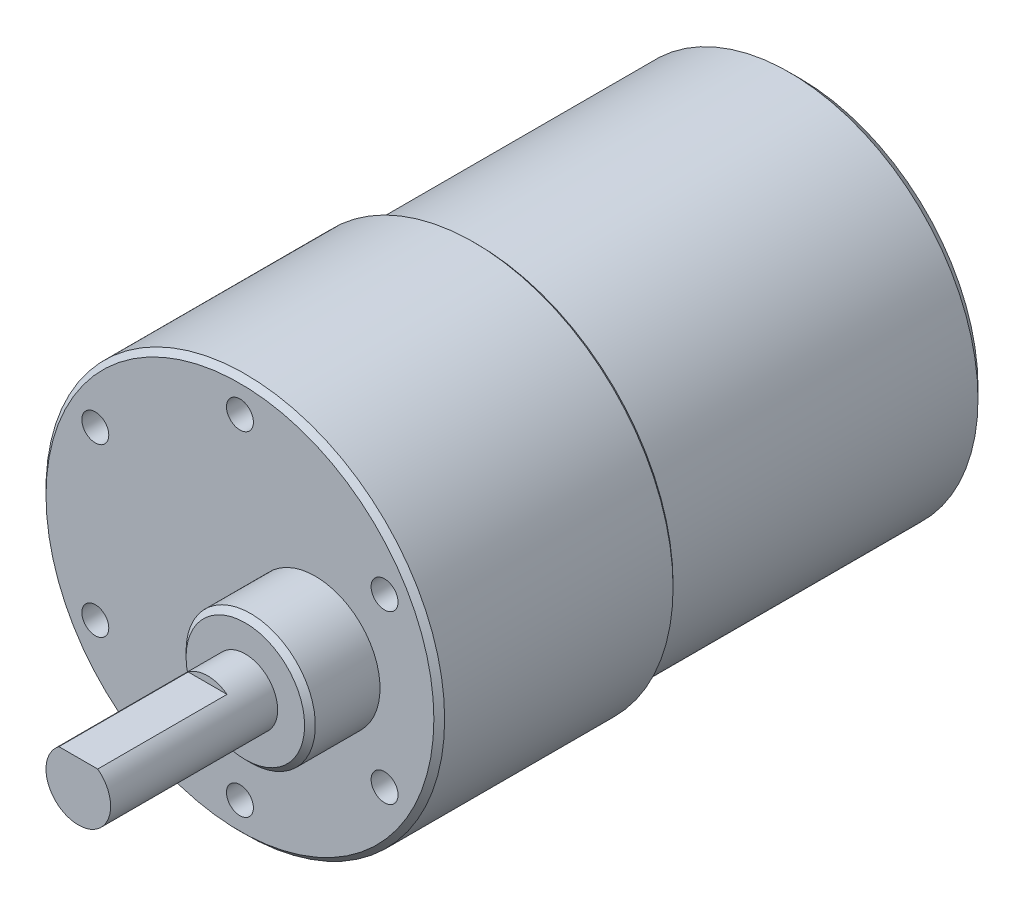
ISO-10303-21;
HEADER;
FILE_DESCRIPTION(('STEP AP214'),'2;1');
FILE_NAME('part.step','',(''),(''),'','','');
FILE_SCHEMA(('AUTOMOTIVE_DESIGN { 1 0 10303 214 1 1 1 1 }'));
ENDSEC;
DATA;
#1=APPLICATION_CONTEXT('core data for automotive mechanical design processes');
#2=APPLICATION_PROTOCOL_DEFINITION('international standard','automotive_design',2000,#1);
#3=PRODUCT_CONTEXT('',#1,'mechanical');
#4=PRODUCT('Part','Part','',(#3));
#5=PRODUCT_RELATED_PRODUCT_CATEGORY('part','',(#4));
#6=PRODUCT_DEFINITION_FORMATION('','',#4);
#7=PRODUCT_DEFINITION_CONTEXT('part definition',#1,'design');
#8=PRODUCT_DEFINITION('design','',#6,#7);
#9=PRODUCT_DEFINITION_SHAPE('','',#8);
#10=(LENGTH_UNIT() NAMED_UNIT(*) SI_UNIT(.MILLI.,.METRE.));
#11=(NAMED_UNIT(*) PLANE_ANGLE_UNIT() SI_UNIT($,.RADIAN.));
#12=(NAMED_UNIT(*) SI_UNIT($,.STERADIAN.) SOLID_ANGLE_UNIT());
#13=UNCERTAINTY_MEASURE_WITH_UNIT(LENGTH_MEASURE(1.E-05),#10,'distance_accuracy_value','');
#14=(GEOMETRIC_REPRESENTATION_CONTEXT(3) GLOBAL_UNCERTAINTY_ASSIGNED_CONTEXT((#13)) GLOBAL_UNIT_ASSIGNED_CONTEXT((#10,
#11,#12)) REPRESENTATION_CONTEXT('',''));
#15=CARTESIAN_POINT('',(0.,0.,0.));
#16=DIRECTION('',(0.,0.,1.));
#17=DIRECTION('',(1.,0.,0.));
#18=AXIS2_PLACEMENT_3D('',#15,#16,#17);
#19=CARTESIAN_POINT('',(0.,0.,62.));
#20=DIRECTION('',(0.,0.,1.));
#21=DIRECTION('',(1.,0.,0.));
#22=AXIS2_PLACEMENT_3D('',#19,#20,#21);
#23=PLANE('',#22);
#24=CARTESIAN_POINT('',(7.,0.,62.));
#25=DIRECTION('',(0.,0.,1.));
#26=DIRECTION('',(1.,0.,0.));
#27=AXIS2_PLACEMENT_3D('',#24,#25,#26);
#28=CIRCLE('',#27,3.);
#29=CARTESIAN_POINT('',(8.8,2.4,62.));
#30=VERTEX_POINT('',#29);
#31=CARTESIAN_POINT('',(5.2,2.4,62.));
#32=VERTEX_POINT('',#31);
#33=EDGE_CURVE('E244',#30,#32,#28,.T.);
#34=ORIENTED_EDGE('',*,*,#33,.T.);
#35=DIRECTION('',(1.,0.,0.));
#36=VECTOR('',#35,1.);
#37=CARTESIAN_POINT('',(0.,2.4,62.));
#38=LINE('',#37,#36);
#39=EDGE_CURVE('E87',#32,#30,#38,.T.);
#40=ORIENTED_EDGE('',*,*,#39,.T.);
#41=EDGE_LOOP('',(#34,#40));
#42=FACE_BOUND('',#41,.T.);
#43=ADVANCED_FACE('F39',(#42),#23,.T.);
#44=CARTESIAN_POINT('',(7.,0.,58.5));
#45=DIRECTION('',(0.,0.,1.));
#46=DIRECTION('',(1.,0.,0.));
#47=AXIS2_PLACEMENT_3D('',#44,#45,#46);
#48=PLANE('',#47);
#49=CARTESIAN_POINT('',(7.,0.,58.5));
#50=DIRECTION('',(0.,0.,1.));
#51=DIRECTION('',(1.,0.,0.));
#52=AXIS2_PLACEMENT_3D('',#49,#50,#51);
#53=CIRCLE('',#52,5.50000000000007);
#54=CARTESIAN_POINT('',(12.5000000000001,0.,58.5));
#55=VERTEX_POINT('',#54);
#56=EDGE_CURVE('E121',#55,#55,#53,.T.);
#57=ORIENTED_EDGE('',*,*,#56,.T.);
#58=EDGE_LOOP('',(#57));
#59=FACE_BOUND('',#58,.T.);
#60=CARTESIAN_POINT('',(7.,0.,58.5));
#61=DIRECTION('',(0.,0.,1.));
#62=DIRECTION('',(1.,0.,0.));
#63=AXIS2_PLACEMENT_3D('',#60,#61,#62);
#64=CIRCLE('',#63,3.);
#65=CARTESIAN_POINT('',(10.,0.,58.5));
#66=VERTEX_POINT('',#65);
#67=EDGE_CURVE('E91',#66,#66,#64,.T.);
#68=ORIENTED_EDGE('',*,*,#67,.F.);
#69=EDGE_LOOP('',(#68));
#70=FACE_BOUND('',#69,.T.);
#71=ADVANCED_FACE('F148',(#59,#70),#48,.T.);
#72=CARTESIAN_POINT('',(0.,0.,52.));
#73=DIRECTION('',(0.,0.,1.));
#74=DIRECTION('',(1.,0.,0.));
#75=AXIS2_PLACEMENT_3D('',#72,#73,#74);
#76=PLANE('',#75);
#77=CARTESIAN_POINT('',(0.,0.,52.));
#78=DIRECTION('',(0.,0.,1.));
#79=DIRECTION('',(1.,0.,0.));
#80=AXIS2_PLACEMENT_3D('',#77,#78,#79);
#81=CIRCLE('',#80,18.);
#82=CARTESIAN_POINT('',(18.,0.,52.));
#83=VERTEX_POINT('',#82);
#84=EDGE_CURVE('E114',#83,#83,#81,.T.);
#85=ORIENTED_EDGE('',*,*,#84,.T.);
#86=EDGE_LOOP('',(#85));
#87=FACE_BOUND('',#86,.T.);
#88=CARTESIAN_POINT('',(0.,-15.5,52.));
#89=DIRECTION('',(0.,0.,1.));
#90=DIRECTION('',(1.,0.,0.));
#91=AXIS2_PLACEMENT_3D('',#88,#89,#90);
#92=CIRCLE('',#91,1.25);
#93=CARTESIAN_POINT('',(1.25,-15.5,52.));
#94=VERTEX_POINT('',#93);
#95=EDGE_CURVE('E254',#94,#94,#92,.T.);
#96=ORIENTED_EDGE('',*,*,#95,.F.);
#97=EDGE_LOOP('',(#96));
#98=FACE_BOUND('',#97,.T.);
#99=CARTESIAN_POINT('',(-13.4233937586588,-7.75,52.));
#100=DIRECTION('',(0.,0.,1.));
#101=DIRECTION('',(1.,0.,0.));
#102=AXIS2_PLACEMENT_3D('',#99,#100,#101);
#103=CIRCLE('',#102,1.25);
#104=CARTESIAN_POINT('',(-12.1733937586588,-7.75,52.));
#105=VERTEX_POINT('',#104);
#106=EDGE_CURVE('E260',#105,#105,#103,.T.);
#107=ORIENTED_EDGE('',*,*,#106,.F.);
#108=EDGE_LOOP('',(#107));
#109=FACE_BOUND('',#108,.T.);
#110=CARTESIAN_POINT('',(-13.4233937586588,7.75000000000001,52.));
#111=DIRECTION('',(0.,0.,1.));
#112=DIRECTION('',(1.,0.,0.));
#113=AXIS2_PLACEMENT_3D('',#110,#111,#112);
#114=CIRCLE('',#113,1.25);
#115=CARTESIAN_POINT('',(-12.1733937586588,7.75000000000001,52.));
#116=VERTEX_POINT('',#115);
#117=EDGE_CURVE('E266',#116,#116,#114,.T.);
#118=ORIENTED_EDGE('',*,*,#117,.F.);
#119=EDGE_LOOP('',(#118));
#120=FACE_BOUND('',#119,.T.);
#121=CARTESIAN_POINT('',(0.,15.5,52.));
#122=DIRECTION('',(0.,0.,1.));
#123=DIRECTION('',(1.,0.,0.));
#124=AXIS2_PLACEMENT_3D('',#121,#122,#123);
#125=CIRCLE('',#124,1.25);
#126=CARTESIAN_POINT('',(1.25,15.5,52.));
#127=VERTEX_POINT('',#126);
#128=EDGE_CURVE('E272',#127,#127,#125,.T.);
#129=ORIENTED_EDGE('',*,*,#128,.F.);
#130=EDGE_LOOP('',(#129));
#131=FACE_BOUND('',#130,.T.);
#132=CARTESIAN_POINT('',(13.4233937586588,7.75000000000001,52.));
#133=DIRECTION('',(0.,0.,1.));
#134=DIRECTION('',(1.,0.,0.));
#135=AXIS2_PLACEMENT_3D('',#132,#133,#134);
#136=CIRCLE('',#135,1.25);
#137=CARTESIAN_POINT('',(14.6733937586588,7.75000000000001,52.));
#138=VERTEX_POINT('',#137);
#139=EDGE_CURVE('E278',#138,#138,#136,.T.);
#140=ORIENTED_EDGE('',*,*,#139,.F.);
#141=EDGE_LOOP('',(#140));
#142=FACE_BOUND('',#141,.T.);
#143=CARTESIAN_POINT('',(13.4233937586588,-7.75,52.));
#144=DIRECTION('',(0.,0.,1.));
#145=DIRECTION('',(1.,0.,0.));
#146=AXIS2_PLACEMENT_3D('',#143,#144,#145);
#147=CIRCLE('',#146,1.25);
#148=CARTESIAN_POINT('',(14.6733937586588,-7.75,52.));
#149=VERTEX_POINT('',#148);
#150=EDGE_CURVE('E247',#149,#149,#147,.T.);
#151=ORIENTED_EDGE('',*,*,#150,.F.);
#152=EDGE_LOOP('',(#151));
#153=FACE_BOUND('',#152,.T.);
#154=CARTESIAN_POINT('',(7.,0.,52.));
#155=DIRECTION('',(0.,0.,1.));
#156=DIRECTION('',(1.,0.,0.));
#157=AXIS2_PLACEMENT_3D('',#154,#155,#156);
#158=CIRCLE('',#157,6.);
#159=CARTESIAN_POINT('',(0.999999999999999,0.,52.));
#160=VERTEX_POINT('',#159);
#161=EDGE_CURVE('E245',#160,#160,#158,.T.);
#162=ORIENTED_EDGE('',*,*,#161,.F.);
#163=EDGE_LOOP('',(#162));
#164=FACE_BOUND('',#163,.T.);
#165=ADVANCED_FACE('F154',(#87,#98,#109,#120,#131,#142,#153,#164),#76,.T.);
#166=CARTESIAN_POINT('',(0.,0.,30.));
#167=DIRECTION('',(0.,0.,-1.));
#168=DIRECTION('',(-1.,0.,0.));
#169=AXIS2_PLACEMENT_3D('',#166,#167,#168);
#170=CYLINDRICAL_SURFACE('',#169,17.5);
#171=CARTESIAN_POINT('',(0.,0.,1.00000000000001));
#172=DIRECTION('',(0.,0.,1.));
#173=DIRECTION('',(1.,0.,0.));
#174=AXIS2_PLACEMENT_3D('',#171,#172,#173);
#175=CIRCLE('',#174,17.5);
#176=CARTESIAN_POINT('',(17.5,0.,1.00000000000001));
#177=VERTEX_POINT('',#176);
#178=EDGE_CURVE('E47',#177,#177,#175,.T.);
#179=ORIENTED_EDGE('',*,*,#178,.T.);
#180=EDGE_LOOP('',(#179));
#181=FACE_BOUND('',#180,.T.);
#182=CARTESIAN_POINT('',(0.,0.,30.));
#183=DIRECTION('',(0.,0.,1.));
#184=DIRECTION('',(1.,0.,0.));
#185=AXIS2_PLACEMENT_3D('',#182,#183,#184);
#186=CIRCLE('',#185,17.5);
#187=CARTESIAN_POINT('',(17.5,0.,30.));
#188=VERTEX_POINT('',#187);
#189=EDGE_CURVE('E118',#188,#188,#186,.T.);
#190=ORIENTED_EDGE('',*,*,#189,.F.);
#191=EDGE_LOOP('',(#190));
#192=FACE_BOUND('',#191,.T.);
#193=ADVANCED_FACE('F135',(#181,#192),#170,.T.);
#194=CARTESIAN_POINT('',(0.,0.,0.));
#195=DIRECTION('',(0.,0.,1.));
#196=DIRECTION('',(1.,0.,0.));
#197=AXIS2_PLACEMENT_3D('',#194,#195,#196);
#198=PLANE('',#197);
#199=CARTESIAN_POINT('',(0.,0.,0.));
#200=DIRECTION('',(0.,0.,1.));
#201=DIRECTION('',(1.,0.,0.));
#202=AXIS2_PLACEMENT_3D('',#199,#200,#201);
#203=CIRCLE('',#202,16.5);
#204=CARTESIAN_POINT('',(16.5,0.,0.));
#205=VERTEX_POINT('',#204);
#206=EDGE_CURVE('E11',#205,#205,#203,.F.);
#207=ORIENTED_EDGE('',*,*,#206,.T.);
#208=EDGE_LOOP('',(#207));
#209=FACE_BOUND('',#208,.T.);
#210=ADVANCED_FACE('F220',(#209),#198,.F.);
#211=CARTESIAN_POINT('',(0.,0.,30.));
#212=DIRECTION('',(0.,0.,1.));
#213=DIRECTION('',(1.,0.,0.));
#214=AXIS2_PLACEMENT_3D('',#211,#212,#213);
#215=PLANE('',#214);
#216=CARTESIAN_POINT('',(0.,0.,30.));
#217=DIRECTION('',(0.,0.,1.));
#218=DIRECTION('',(1.,0.,0.));
#219=AXIS2_PLACEMENT_3D('',#216,#217,#218);
#220=CIRCLE('',#219,18.2);
#221=CARTESIAN_POINT('',(18.2,0.,30.));
#222=VERTEX_POINT('',#221);
#223=EDGE_CURVE('E130',#222,#222,#220,.F.);
#224=ORIENTED_EDGE('',*,*,#223,.T.);
#225=EDGE_LOOP('',(#224));
#226=FACE_BOUND('',#225,.T.);
#227=ORIENTED_EDGE('',*,*,#189,.T.);
#228=EDGE_LOOP('',(#227));
#229=FACE_BOUND('',#228,.T.);
#230=ADVANCED_FACE('F217',(#226,#229),#215,.F.);
#231=CARTESIAN_POINT('',(0.,0.,52.));
#232=DIRECTION('',(0.,0.,-1.));
#233=DIRECTION('',(-1.,0.,0.));
#234=AXIS2_PLACEMENT_3D('',#231,#232,#233);
#235=CYLINDRICAL_SURFACE('',#234,18.5);
#236=CARTESIAN_POINT('',(0.,0.,30.3));
#237=DIRECTION('',(0.,0.,1.));
#238=DIRECTION('',(1.,0.,0.));
#239=AXIS2_PLACEMENT_3D('',#236,#237,#238);
#240=CIRCLE('',#239,18.5);
#241=CARTESIAN_POINT('',(18.5,0.,30.3));
#242=VERTEX_POINT('',#241);
#243=EDGE_CURVE('E127',#242,#242,#240,.T.);
#244=ORIENTED_EDGE('',*,*,#243,.T.);
#245=EDGE_LOOP('',(#244));
#246=FACE_BOUND('',#245,.T.);
#247=CARTESIAN_POINT('',(0.,0.,51.5));
#248=DIRECTION('',(0.,0.,1.));
#249=DIRECTION('',(1.,0.,0.));
#250=AXIS2_PLACEMENT_3D('',#247,#248,#249);
#251=CIRCLE('',#250,18.5);
#252=CARTESIAN_POINT('',(18.5,0.,51.5));
#253=VERTEX_POINT('',#252);
#254=EDGE_CURVE('E117',#253,#253,#251,.F.);
#255=ORIENTED_EDGE('',*,*,#254,.T.);
#256=EDGE_LOOP('',(#255));
#257=FACE_BOUND('',#256,.T.);
#258=ADVANCED_FACE('F213',(#246,#257),#235,.T.);
#259=CARTESIAN_POINT('',(0.,-15.5,44.5));
#260=DIRECTION('',(0.,0.,1.));
#261=DIRECTION('',(1.,0.,0.));
#262=AXIS2_PLACEMENT_3D('',#259,#260,#261);
#263=CONICAL_SURFACE('',#262,1.25,1.02974425867665);
#264=CARTESIAN_POINT('',(0.,-15.5,43.7489242262155));
#265=VERTEX_POINT('',#264);
#266=VERTEX_LOOP('',#265);
#267=FACE_BOUND('',#266,.T.);
#268=CARTESIAN_POINT('',(0.,-15.5,44.5));
#269=DIRECTION('',(0.,0.,1.));
#270=DIRECTION('',(1.,0.,0.));
#271=AXIS2_PLACEMENT_3D('',#268,#269,#270);
#272=CIRCLE('',#271,1.25);
#273=CARTESIAN_POINT('',(1.25,-15.5,44.5));
#274=VERTEX_POINT('',#273);
#275=EDGE_CURVE('E251',#274,#274,#272,.T.);
#276=ORIENTED_EDGE('',*,*,#275,.T.);
#277=EDGE_LOOP('',(#276));
#278=FACE_BOUND('',#277,.T.);
#279=ADVANCED_FACE('F209',(#267,#278),#263,.F.);
#280=CARTESIAN_POINT('',(0.,-15.5,52.));
#281=DIRECTION('',(0.,0.,1.));
#282=DIRECTION('',(1.,0.,0.));
#283=AXIS2_PLACEMENT_3D('',#280,#281,#282);
#284=CYLINDRICAL_SURFACE('',#283,1.25);
#285=ORIENTED_EDGE('',*,*,#275,.F.);
#286=EDGE_LOOP('',(#285));
#287=FACE_BOUND('',#286,.T.);
#288=ORIENTED_EDGE('',*,*,#95,.T.);
#289=EDGE_LOOP('',(#288));
#290=FACE_BOUND('',#289,.T.);
#291=ADVANCED_FACE('F205',(#287,#290),#284,.F.);
#292=CARTESIAN_POINT('',(-13.4233937586588,-7.75,44.5));
#293=DIRECTION('',(0.,0.,1.));
#294=DIRECTION('',(1.,0.,0.));
#295=AXIS2_PLACEMENT_3D('',#292,#293,#294);
#296=CONICAL_SURFACE('',#295,1.25,1.02974425867665);
#297=CARTESIAN_POINT('',(-13.4233937586588,-7.75,43.7489242262155));
#298=VERTEX_POINT('',#297);
#299=VERTEX_LOOP('',#298);
#300=FACE_BOUND('',#299,.T.);
#301=CARTESIAN_POINT('',(-13.4233937586588,-7.75,44.5));
#302=DIRECTION('',(0.,0.,1.));
#303=DIRECTION('',(1.,0.,0.));
#304=AXIS2_PLACEMENT_3D('',#301,#302,#303);
#305=CIRCLE('',#304,1.25);
#306=CARTESIAN_POINT('',(-12.1733937586588,-7.75,44.5));
#307=VERTEX_POINT('',#306);
#308=EDGE_CURVE('E257',#307,#307,#305,.T.);
#309=ORIENTED_EDGE('',*,*,#308,.T.);
#310=EDGE_LOOP('',(#309));
#311=FACE_BOUND('',#310,.T.);
#312=ADVANCED_FACE('F201',(#300,#311),#296,.F.);
#313=CARTESIAN_POINT('',(-13.4233937586588,-7.75,52.));
#314=DIRECTION('',(0.,0.,1.));
#315=DIRECTION('',(1.,0.,0.));
#316=AXIS2_PLACEMENT_3D('',#313,#314,#315);
#317=CYLINDRICAL_SURFACE('',#316,1.25);
#318=ORIENTED_EDGE('',*,*,#308,.F.);
#319=EDGE_LOOP('',(#318));
#320=FACE_BOUND('',#319,.T.);
#321=ORIENTED_EDGE('',*,*,#106,.T.);
#322=EDGE_LOOP('',(#321));
#323=FACE_BOUND('',#322,.T.);
#324=ADVANCED_FACE('F197',(#320,#323),#317,.F.);
#325=CARTESIAN_POINT('',(-13.4233937586588,7.75000000000001,44.5));
#326=DIRECTION('',(0.,0.,1.));
#327=DIRECTION('',(1.,0.,0.));
#328=AXIS2_PLACEMENT_3D('',#325,#326,#327);
#329=CONICAL_SURFACE('',#328,1.25,1.02974425867665);
#330=CARTESIAN_POINT('',(-13.4233937586588,7.75000000000001,43.7489242262155));
#331=VERTEX_POINT('',#330);
#332=VERTEX_LOOP('',#331);
#333=FACE_BOUND('',#332,.T.);
#334=CARTESIAN_POINT('',(-13.4233937586588,7.75000000000001,44.5));
#335=DIRECTION('',(0.,0.,1.));
#336=DIRECTION('',(1.,0.,0.));
#337=AXIS2_PLACEMENT_3D('',#334,#335,#336);
#338=CIRCLE('',#337,1.25);
#339=CARTESIAN_POINT('',(-12.1733937586588,7.75000000000001,44.5));
#340=VERTEX_POINT('',#339);
#341=EDGE_CURVE('E263',#340,#340,#338,.T.);
#342=ORIENTED_EDGE('',*,*,#341,.T.);
#343=EDGE_LOOP('',(#342));
#344=FACE_BOUND('',#343,.T.);
#345=ADVANCED_FACE('F193',(#333,#344),#329,.F.);
#346=CARTESIAN_POINT('',(-13.4233937586588,7.75000000000001,52.));
#347=DIRECTION('',(0.,0.,1.));
#348=DIRECTION('',(1.,0.,0.));
#349=AXIS2_PLACEMENT_3D('',#346,#347,#348);
#350=CYLINDRICAL_SURFACE('',#349,1.25);
#351=ORIENTED_EDGE('',*,*,#341,.F.);
#352=EDGE_LOOP('',(#351));
#353=FACE_BOUND('',#352,.T.);
#354=ORIENTED_EDGE('',*,*,#117,.T.);
#355=EDGE_LOOP('',(#354));
#356=FACE_BOUND('',#355,.T.);
#357=ADVANCED_FACE('F189',(#353,#356),#350,.F.);
#358=CARTESIAN_POINT('',(0.,15.5,44.5));
#359=DIRECTION('',(0.,0.,1.));
#360=DIRECTION('',(1.,0.,0.));
#361=AXIS2_PLACEMENT_3D('',#358,#359,#360);
#362=CONICAL_SURFACE('',#361,1.25,1.02974425867665);
#363=CARTESIAN_POINT('',(0.,15.5,43.7489242262155));
#364=VERTEX_POINT('',#363);
#365=VERTEX_LOOP('',#364);
#366=FACE_BOUND('',#365,.T.);
#367=CARTESIAN_POINT('',(0.,15.5,44.5));
#368=DIRECTION('',(0.,0.,1.));
#369=DIRECTION('',(1.,0.,0.));
#370=AXIS2_PLACEMENT_3D('',#367,#368,#369);
#371=CIRCLE('',#370,1.25);
#372=CARTESIAN_POINT('',(1.25,15.5,44.5));
#373=VERTEX_POINT('',#372);
#374=EDGE_CURVE('E269',#373,#373,#371,.T.);
#375=ORIENTED_EDGE('',*,*,#374,.T.);
#376=EDGE_LOOP('',(#375));
#377=FACE_BOUND('',#376,.T.);
#378=ADVANCED_FACE('F185',(#366,#377),#362,.F.);
#379=CARTESIAN_POINT('',(0.,15.5,52.));
#380=DIRECTION('',(0.,0.,1.));
#381=DIRECTION('',(1.,0.,0.));
#382=AXIS2_PLACEMENT_3D('',#379,#380,#381);
#383=CYLINDRICAL_SURFACE('',#382,1.25);
#384=ORIENTED_EDGE('',*,*,#374,.F.);
#385=EDGE_LOOP('',(#384));
#386=FACE_BOUND('',#385,.T.);
#387=ORIENTED_EDGE('',*,*,#128,.T.);
#388=EDGE_LOOP('',(#387));
#389=FACE_BOUND('',#388,.T.);
#390=ADVANCED_FACE('F181',(#386,#389),#383,.F.);
#391=CARTESIAN_POINT('',(13.4233937586588,7.75000000000001,44.5));
#392=DIRECTION('',(0.,0.,1.));
#393=DIRECTION('',(1.,0.,0.));
#394=AXIS2_PLACEMENT_3D('',#391,#392,#393);
#395=CONICAL_SURFACE('',#394,1.25,1.02974425867665);
#396=CARTESIAN_POINT('',(13.4233937586588,7.75000000000001,43.7489242262155));
#397=VERTEX_POINT('',#396);
#398=VERTEX_LOOP('',#397);
#399=FACE_BOUND('',#398,.T.);
#400=CARTESIAN_POINT('',(13.4233937586588,7.75000000000001,44.5));
#401=DIRECTION('',(0.,0.,1.));
#402=DIRECTION('',(1.,0.,0.));
#403=AXIS2_PLACEMENT_3D('',#400,#401,#402);
#404=CIRCLE('',#403,1.25);
#405=CARTESIAN_POINT('',(14.6733937586588,7.75000000000001,44.5));
#406=VERTEX_POINT('',#405);
#407=EDGE_CURVE('E275',#406,#406,#404,.T.);
#408=ORIENTED_EDGE('',*,*,#407,.T.);
#409=EDGE_LOOP('',(#408));
#410=FACE_BOUND('',#409,.T.);
#411=ADVANCED_FACE('F177',(#399,#410),#395,.F.);
#412=CARTESIAN_POINT('',(13.4233937586588,7.75000000000001,52.));
#413=DIRECTION('',(0.,0.,1.));
#414=DIRECTION('',(1.,0.,0.));
#415=AXIS2_PLACEMENT_3D('',#412,#413,#414);
#416=CYLINDRICAL_SURFACE('',#415,1.25);
#417=ORIENTED_EDGE('',*,*,#407,.F.);
#418=EDGE_LOOP('',(#417));
#419=FACE_BOUND('',#418,.T.);
#420=ORIENTED_EDGE('',*,*,#139,.T.);
#421=EDGE_LOOP('',(#420));
#422=FACE_BOUND('',#421,.T.);
#423=ADVANCED_FACE('F173',(#419,#422),#416,.F.);
#424=CARTESIAN_POINT('',(13.4233937586588,-7.75,44.5));
#425=DIRECTION('',(0.,0.,1.));
#426=DIRECTION('',(1.,0.,0.));
#427=AXIS2_PLACEMENT_3D('',#424,#425,#426);
#428=CONICAL_SURFACE('',#427,1.25,1.02974425867665);
#429=CARTESIAN_POINT('',(13.4233937586588,-7.75,43.7489242262155));
#430=VERTEX_POINT('',#429);
#431=VERTEX_LOOP('',#430);
#432=FACE_BOUND('',#431,.T.);
#433=CARTESIAN_POINT('',(13.4233937586588,-7.75,44.5));
#434=DIRECTION('',(0.,0.,1.));
#435=DIRECTION('',(1.,0.,0.));
#436=AXIS2_PLACEMENT_3D('',#433,#434,#435);
#437=CIRCLE('',#436,1.25);
#438=CARTESIAN_POINT('',(14.6733937586588,-7.75,44.5));
#439=VERTEX_POINT('',#438);
#440=EDGE_CURVE('E281',#439,#439,#437,.T.);
#441=ORIENTED_EDGE('',*,*,#440,.T.);
#442=EDGE_LOOP('',(#441));
#443=FACE_BOUND('',#442,.T.);
#444=ADVANCED_FACE('F169',(#432,#443),#428,.F.);
#445=CARTESIAN_POINT('',(13.4233937586588,-7.75,52.));
#446=DIRECTION('',(0.,0.,1.));
#447=DIRECTION('',(1.,0.,0.));
#448=AXIS2_PLACEMENT_3D('',#445,#446,#447);
#449=CYLINDRICAL_SURFACE('',#448,1.25);
#450=ORIENTED_EDGE('',*,*,#440,.F.);
#451=EDGE_LOOP('',(#450));
#452=FACE_BOUND('',#451,.T.);
#453=ORIENTED_EDGE('',*,*,#150,.T.);
#454=EDGE_LOOP('',(#453));
#455=FACE_BOUND('',#454,.T.);
#456=ADVANCED_FACE('F165',(#452,#455),#449,.F.);
#457=CARTESIAN_POINT('',(7.,0.,58.5));
#458=DIRECTION('',(0.,0.,-1.));
#459=DIRECTION('',(-1.,0.,0.));
#460=AXIS2_PLACEMENT_3D('',#457,#458,#459);
#461=CYLINDRICAL_SURFACE('',#460,6.);
#462=CARTESIAN_POINT('',(7.,0.,58.0000000000001));
#463=DIRECTION('',(0.,0.,1.));
#464=DIRECTION('',(1.,0.,0.));
#465=AXIS2_PLACEMENT_3D('',#462,#463,#464);
#466=CIRCLE('',#465,6.);
#467=CARTESIAN_POINT('',(0.999999999999999,0.,58.0000000000001));
#468=VERTEX_POINT('',#467);
#469=EDGE_CURVE('E124',#468,#468,#466,.F.);
#470=CARTESIAN_POINT('',(0.999999999999999,0.,58.0000000000001));
#471=CARTESIAN_POINT('',(0.999999999999999,0.,57.9375000000001));
#472=CARTESIAN_POINT('',(0.999999999999999,0.,57.875));
#473=CARTESIAN_POINT('',(0.999999999999999,0.,57.75));
#474=CARTESIAN_POINT('',(0.999999999999999,0.,57.6875));
#475=CARTESIAN_POINT('',(0.999999999999999,0.,57.5625));
#476=CARTESIAN_POINT('',(0.999999999999999,0.,57.5));
#477=CARTESIAN_POINT('',(0.999999999999999,0.,57.375));
#478=CARTESIAN_POINT('',(0.999999999999999,0.,57.3125));
#479=CARTESIAN_POINT('',(0.999999999999999,0.,57.1875));
#480=CARTESIAN_POINT('',(0.999999999999999,0.,57.125));
#481=CARTESIAN_POINT('',(0.999999999999999,0.,57.));
#482=CARTESIAN_POINT('',(0.999999999999999,0.,56.9375));
#483=CARTESIAN_POINT('',(0.999999999999999,0.,56.8125));
#484=CARTESIAN_POINT('',(0.999999999999999,0.,56.75));
#485=CARTESIAN_POINT('',(0.999999999999999,0.,56.625));
#486=CARTESIAN_POINT('',(0.999999999999999,0.,56.5625));
#487=CARTESIAN_POINT('',(0.999999999999999,0.,56.4375));
#488=CARTESIAN_POINT('',(0.999999999999999,0.,56.375));
#489=CARTESIAN_POINT('',(0.999999999999999,0.,56.25));
#490=CARTESIAN_POINT('',(0.999999999999999,0.,56.1875));
#491=CARTESIAN_POINT('',(0.999999999999999,0.,56.0625));
#492=CARTESIAN_POINT('',(0.999999999999999,0.,56.));
#493=CARTESIAN_POINT('',(0.999999999999999,0.,55.875));
#494=CARTESIAN_POINT('',(0.999999999999999,0.,55.8125));
#495=CARTESIAN_POINT('',(0.999999999999999,0.,55.6875));
#496=CARTESIAN_POINT('',(0.999999999999999,0.,55.625));
#497=CARTESIAN_POINT('',(0.999999999999999,0.,55.5));
#498=CARTESIAN_POINT('',(0.999999999999999,0.,55.4375));
#499=CARTESIAN_POINT('',(0.999999999999999,0.,55.3125));
#500=CARTESIAN_POINT('',(0.999999999999999,0.,55.25));
#501=CARTESIAN_POINT('',(0.999999999999999,0.,55.125));
#502=CARTESIAN_POINT('',(0.999999999999999,0.,55.0625));
#503=CARTESIAN_POINT('',(0.999999999999999,0.,54.9375));
#504=CARTESIAN_POINT('',(0.999999999999999,0.,54.875));
#505=CARTESIAN_POINT('',(0.999999999999999,0.,54.75));
#506=CARTESIAN_POINT('',(0.999999999999999,0.,54.6875));
#507=CARTESIAN_POINT('',(0.999999999999999,0.,54.5625));
#508=CARTESIAN_POINT('',(0.999999999999999,0.,54.5));
#509=CARTESIAN_POINT('',(0.999999999999999,0.,54.375));
#510=CARTESIAN_POINT('',(0.999999999999999,0.,54.3125));
#511=CARTESIAN_POINT('',(0.999999999999999,0.,54.1875));
#512=CARTESIAN_POINT('',(0.999999999999999,0.,54.125));
#513=CARTESIAN_POINT('',(0.999999999999999,0.,54.));
#514=CARTESIAN_POINT('',(0.999999999999999,0.,53.9375));
#515=CARTESIAN_POINT('',(0.999999999999999,0.,53.8125));
#516=CARTESIAN_POINT('',(0.999999999999999,0.,53.75));
#517=CARTESIAN_POINT('',(0.999999999999999,0.,53.625));
#518=CARTESIAN_POINT('',(0.999999999999999,0.,53.5625));
#519=CARTESIAN_POINT('',(0.999999999999999,0.,53.4375));
#520=CARTESIAN_POINT('',(0.999999999999999,0.,53.375));
#521=CARTESIAN_POINT('',(0.999999999999999,0.,53.25));
#522=CARTESIAN_POINT('',(0.999999999999999,0.,53.1875));
#523=CARTESIAN_POINT('',(0.999999999999999,0.,53.0625));
#524=CARTESIAN_POINT('',(0.999999999999999,0.,53.));
#525=CARTESIAN_POINT('',(0.999999999999999,0.,52.875));
#526=CARTESIAN_POINT('',(0.999999999999999,0.,52.8125));
#527=CARTESIAN_POINT('',(0.999999999999999,0.,52.6875));
#528=CARTESIAN_POINT('',(0.999999999999999,0.,52.625));
#529=CARTESIAN_POINT('',(0.999999999999999,0.,52.5));
#530=CARTESIAN_POINT('',(0.999999999999999,0.,52.4375));
#531=CARTESIAN_POINT('',(0.999999999999999,0.,52.3125));
#532=CARTESIAN_POINT('',(0.999999999999999,0.,52.25));
#533=CARTESIAN_POINT('',(0.999999999999999,0.,52.125));
#534=CARTESIAN_POINT('',(0.999999999999999,0.,52.0625));
#535=CARTESIAN_POINT('',(0.999999999999999,0.,52.));
#536=B_SPLINE_CURVE_WITH_KNOTS('',3,(#470,#471,#472,#473,#474,#475,#476,#477,#478,#479,#480,
#481,#482,#483,#484,#485,#486,#487,#488,#489,#490,#491,#492,#493,#494,#495,#496,#497,#498,#499,
#500,#501,#502,#503,#504,#505,#506,#507,#508,#509,#510,#511,#512,#513,#514,#515,#516,#517,#518,
#519,#520,#521,#522,#523,#524,#525,#526,#527,#528,#529,#530,#531,#532,#533,#534,#535),
.UNSPECIFIED.,.F.,.F.,(4,2,2,2,2,2,2,2,2,2,2,2,2,2,2,2,2,2,2,2,2,2,2,2,2,2,2,2,2,2,2,2,4),(0.,
0.187500000000007,0.375000000000007,0.562500000000007,0.750000000000008,0.937500000000015,
1.12500000000001,1.31250000000002,1.50000000000002,1.68750000000002,1.87500000000002,
2.06250000000002,2.25000000000002,2.43750000000003,2.62500000000003,2.81250000000003,
3.00000000000003,3.18750000000004,3.37500000000004,3.56250000000004,3.75000000000004,
3.93750000000005,4.12500000000005,4.31250000000005,4.50000000000005,4.68750000000005,
4.87500000000005,5.06250000000005,5.25000000000005,5.43750000000006,5.62500000000006,
5.81250000000006,6.00000000000006),.UNSPECIFIED.);
#537=EDGE_CURVE('BSEAM161',#468,#160,#536,.T.);
#538=ORIENTED_EDGE('',*,*,#469,.T.);
#539=ORIENTED_EDGE('',*,*,#161,.T.);
#540=ORIENTED_EDGE('',*,*,#537,.T.);
#541=ORIENTED_EDGE('',*,*,#537,.F.);
#542=EDGE_LOOP('',(#538,#540,#539,#541));
#543=FACE_BOUND('',#542,.T.);
#544=ADVANCED_FACE('F161',(#543),#461,.T.);
#545=CARTESIAN_POINT('',(7.,0.,62.));
#546=DIRECTION('',(0.,0.,-1.));
#547=DIRECTION('',(-1.,0.,0.));
#548=AXIS2_PLACEMENT_3D('',#545,#546,#547);
#549=CYLINDRICAL_SURFACE('',#548,3.);
#550=ORIENTED_EDGE('',*,*,#33,.F.);
#551=DIRECTION('',(0.,0.,-1.));
#552=VECTOR('',#551,1.);
#553=CARTESIAN_POINT('',(8.8,2.4,74.));
#554=LINE('',#553,#552);
#555=CARTESIAN_POINT('',(8.8,2.4,74.));
#556=VERTEX_POINT('',#555);
#557=EDGE_CURVE('E54',#556,#30,#554,.T.);
#558=ORIENTED_EDGE('',*,*,#557,.F.);
#559=CARTESIAN_POINT('',(7.,0.,74.));
#560=DIRECTION('',(0.,0.,1.));
#561=DIRECTION('',(1.,0.,0.));
#562=AXIS2_PLACEMENT_3D('',#559,#560,#561);
#563=CIRCLE('',#562,3.);
#564=CARTESIAN_POINT('',(5.2,2.4,74.));
#565=VERTEX_POINT('',#564);
#566=EDGE_CURVE('E93',#565,#556,#563,.T.);
#567=ORIENTED_EDGE('',*,*,#566,.F.);
#568=DIRECTION('',(0.,0.,-1.));
#569=VECTOR('',#568,1.);
#570=CARTESIAN_POINT('',(5.2,2.4,74.));
#571=LINE('',#570,#569);
#572=EDGE_CURVE('E82',#565,#32,#571,.T.);
#573=ORIENTED_EDGE('',*,*,#572,.T.);
#574=EDGE_LOOP('',(#550,#558,#567,#573));
#575=FACE_BOUND('',#574,.T.);
#576=ORIENTED_EDGE('',*,*,#67,.T.);
#577=EDGE_LOOP('',(#576));
#578=FACE_BOUND('',#577,.T.);
#579=ADVANCED_FACE('F94',(#575,#578),#549,.T.);
#580=CARTESIAN_POINT('',(0.,2.4,74.));
#581=DIRECTION('',(0.,1.,0.));
#582=DIRECTION('',(0.,0.,1.));
#583=AXIS2_PLACEMENT_3D('',#580,#581,#582);
#584=PLANE('',#583);
#585=ORIENTED_EDGE('',*,*,#39,.F.);
#586=ORIENTED_EDGE('',*,*,#572,.F.);
#587=DIRECTION('',(1.,0.,0.));
#588=VECTOR('',#587,1.);
#589=CARTESIAN_POINT('',(0.,2.4,74.));
#590=LINE('',#589,#588);
#591=EDGE_CURVE('E86',#565,#556,#590,.T.);
#592=ORIENTED_EDGE('',*,*,#591,.T.);
#593=ORIENTED_EDGE('',*,*,#557,.T.);
#594=EDGE_LOOP('',(#585,#586,#592,#593));
#595=FACE_BOUND('',#594,.T.);
#596=ADVANCED_FACE('F84',(#595),#584,.T.);
#597=CARTESIAN_POINT('',(0.,0.,74.));
#598=DIRECTION('',(0.,0.,1.));
#599=DIRECTION('',(1.,0.,0.));
#600=AXIS2_PLACEMENT_3D('',#597,#598,#599);
#601=PLANE('',#600);
#602=ORIENTED_EDGE('',*,*,#591,.F.);
#603=ORIENTED_EDGE('',*,*,#566,.T.);
#604=EDGE_LOOP('',(#602,#603));
#605=FACE_BOUND('',#604,.T.);
#606=ADVANCED_FACE('F98',(#605),#601,.T.);
#607=CARTESIAN_POINT('',(0.,0.,52.));
#608=DIRECTION('',(0.,0.,-1.));
#609=DIRECTION('',(-1.,0.,0.));
#610=AXIS2_PLACEMENT_3D('',#607,#608,#609);
#611=CONICAL_SURFACE('',#610,18.,0.785398163397445);
#612=ORIENTED_EDGE('',*,*,#254,.F.);
#613=EDGE_LOOP('',(#612));
#614=FACE_BOUND('',#613,.T.);
#615=ORIENTED_EDGE('',*,*,#84,.F.);
#616=EDGE_LOOP('',(#615));
#617=FACE_BOUND('',#616,.T.);
#618=ADVANCED_FACE('F230',(#614,#617),#611,.T.);
#619=CARTESIAN_POINT('',(7.,0.,58.5));
#620=DIRECTION('',(0.,0.,-1.));
#621=DIRECTION('',(-1.,0.,0.));
#622=AXIS2_PLACEMENT_3D('',#619,#620,#621);
#623=CONICAL_SURFACE('',#622,5.50000000000007,0.785398163397438);
#624=ORIENTED_EDGE('',*,*,#469,.F.);
#625=EDGE_LOOP('',(#624));
#626=FACE_BOUND('',#625,.T.);
#627=ORIENTED_EDGE('',*,*,#56,.F.);
#628=EDGE_LOOP('',(#627));
#629=FACE_BOUND('',#628,.T.);
#630=ADVANCED_FACE('F144',(#626,#629),#623,.T.);
#631=CARTESIAN_POINT('',(0.,0.,30.3));
#632=DIRECTION('',(0.,0.,1.));
#633=DIRECTION('',(1.,0.,0.));
#634=AXIS2_PLACEMENT_3D('',#631,#632,#633);
#635=CONICAL_SURFACE('',#634,18.5,0.785398163397443);
#636=ORIENTED_EDGE('',*,*,#223,.F.);
#637=EDGE_LOOP('',(#636));
#638=FACE_BOUND('',#637,.T.);
#639=ORIENTED_EDGE('',*,*,#243,.F.);
#640=EDGE_LOOP('',(#639));
#641=FACE_BOUND('',#640,.T.);
#642=ADVANCED_FACE('F139',(#638,#641),#635,.T.);
#643=CARTESIAN_POINT('',(0.,0.,1.00000000000001));
#644=DIRECTION('',(0.,0.,1.));
#645=DIRECTION('',(1.,0.,0.));
#646=AXIS2_PLACEMENT_3D('',#643,#644,#645);
#647=CONICAL_SURFACE('',#646,17.5,0.78539816339745);
#648=ORIENTED_EDGE('',*,*,#206,.F.);
#649=EDGE_LOOP('',(#648));
#650=FACE_BOUND('',#649,.T.);
#651=ORIENTED_EDGE('',*,*,#178,.F.);
#652=EDGE_LOOP('',(#651));
#653=FACE_BOUND('',#652,.T.);
#654=ADVANCED_FACE('F41',(#650,#653),#647,.T.);
#655=CLOSED_SHELL('',(#43,#71,#165,#193,#210,#230,#258,#279,#291,#312,#324,#345,#357,#378,#390,
#411,#423,#444,#456,#544,#579,#596,#606,#618,#630,#642,#654));
#656=MANIFOLD_SOLID_BREP('B2',#655);
#657=ADVANCED_BREP_SHAPE_REPRESENTATION('',(#18,#656),#14);
#658=SHAPE_DEFINITION_REPRESENTATION(#9,#657);
ENDSEC;
END-ISO-10303-21;
